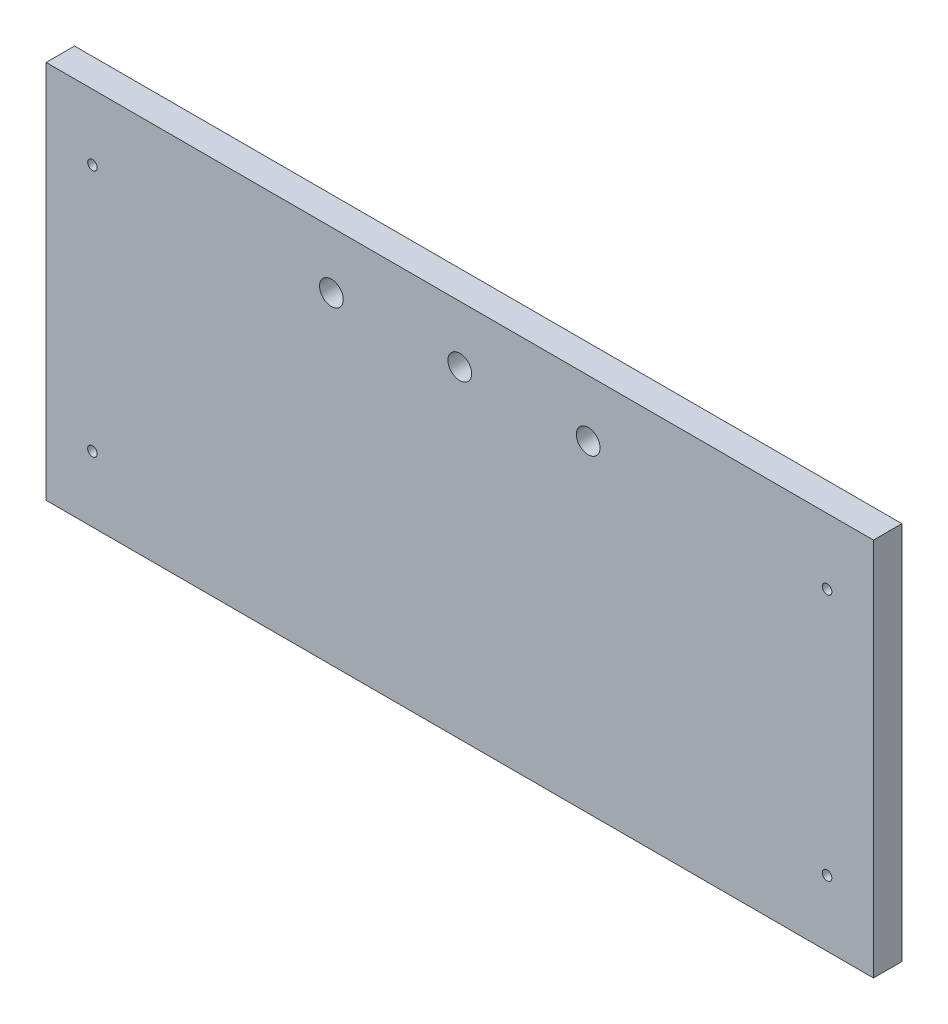
ISO-10303-21;
HEADER;
FILE_DESCRIPTION(('STEP AP214'),'2;1');
FILE_NAME('part.step','',(''),(''),'','','');
FILE_SCHEMA(('AUTOMOTIVE_DESIGN { 1 0 10303 214 1 1 1 1 }'));
ENDSEC;
DATA;
#1=APPLICATION_CONTEXT('core data for automotive mechanical design processes');
#2=APPLICATION_PROTOCOL_DEFINITION('international standard','automotive_design',2000,#1);
#3=PRODUCT_CONTEXT('',#1,'mechanical');
#4=PRODUCT('Part','Part','',(#3));
#5=PRODUCT_RELATED_PRODUCT_CATEGORY('part','',(#4));
#6=PRODUCT_DEFINITION_FORMATION('','',#4);
#7=PRODUCT_DEFINITION_CONTEXT('part definition',#1,'design');
#8=PRODUCT_DEFINITION('design','',#6,#7);
#9=PRODUCT_DEFINITION_SHAPE('','',#8);
#10=(LENGTH_UNIT() NAMED_UNIT(*) SI_UNIT(.MILLI.,.METRE.));
#11=(NAMED_UNIT(*) PLANE_ANGLE_UNIT() SI_UNIT($,.RADIAN.));
#12=(NAMED_UNIT(*) SI_UNIT($,.STERADIAN.) SOLID_ANGLE_UNIT());
#13=UNCERTAINTY_MEASURE_WITH_UNIT(LENGTH_MEASURE(1.E-05),#10,'distance_accuracy_value','');
#14=(GEOMETRIC_REPRESENTATION_CONTEXT(3) GLOBAL_UNCERTAINTY_ASSIGNED_CONTEXT((#13)) GLOBAL_UNIT_ASSIGNED_CONTEXT((#10,
#11,#12)) REPRESENTATION_CONTEXT('',''));
#15=CARTESIAN_POINT('',(0.,0.,0.));
#16=DIRECTION('',(0.,0.,1.));
#17=DIRECTION('',(1.,0.,0.));
#18=AXIS2_PLACEMENT_3D('',#15,#16,#17);
#19=CARTESIAN_POINT('',(0.,0.,9.525));
#20=DIRECTION('',(0.,0.,-1.));
#21=DIRECTION('',(-1.,0.,0.));
#22=AXIS2_PLACEMENT_3D('',#19,#20,#21);
#23=PLANE('',#22);
#24=DIRECTION('',(0.,-1.,0.));
#25=VECTOR('',#24,1.);
#26=CARTESIAN_POINT('',(0.,0.,9.525));
#27=LINE('',#26,#25);
#28=CARTESIAN_POINT('',(0.,127.,9.525));
#29=VERTEX_POINT('',#28);
#30=CARTESIAN_POINT('',(0.,0.,9.525));
#31=VERTEX_POINT('',#30);
#32=EDGE_CURVE('E85',#29,#31,#27,.T.);
#33=ORIENTED_EDGE('',*,*,#32,.T.);
#34=DIRECTION('',(1.,0.,0.));
#35=VECTOR('',#34,1.);
#36=CARTESIAN_POINT('',(0.,0.,9.525));
#37=LINE('',#36,#35);
#38=CARTESIAN_POINT('',(277.05,0.,9.525));
#39=VERTEX_POINT('',#38);
#40=EDGE_CURVE('E80',#31,#39,#37,.T.);
#41=ORIENTED_EDGE('',*,*,#40,.T.);
#42=DIRECTION('',(0.,1.,0.));
#43=VECTOR('',#42,1.);
#44=CARTESIAN_POINT('',(277.05,0.,9.525));
#45=LINE('',#44,#43);
#46=CARTESIAN_POINT('',(277.05,127.,9.525));
#47=VERTEX_POINT('',#46);
#48=EDGE_CURVE('E83',#39,#47,#45,.T.);
#49=ORIENTED_EDGE('',*,*,#48,.T.);
#50=DIRECTION('',(-1.,0.,0.));
#51=VECTOR('',#50,1.);
#52=CARTESIAN_POINT('',(0.,127.,9.525));
#53=LINE('',#52,#51);
#54=EDGE_CURVE('E50',#47,#29,#53,.T.);
#55=ORIENTED_EDGE('',*,*,#54,.T.);
#56=EDGE_LOOP('',(#33,#41,#49,#55));
#57=FACE_BOUND('',#56,.T.);
#58=CARTESIAN_POINT('',(95.525,107.95,9.525));
#59=DIRECTION('',(0.,0.,1.));
#60=DIRECTION('',(1.,0.,0.));
#61=AXIS2_PLACEMENT_3D('',#58,#59,#60);
#62=CIRCLE('',#61,3.96874999999999);
#63=CARTESIAN_POINT('',(91.55625,107.95,9.525));
#64=VERTEX_POINT('',#63);
#65=EDGE_CURVE('E100',#64,#64,#62,.T.);
#66=ORIENTED_EDGE('',*,*,#65,.F.);
#67=EDGE_LOOP('',(#66));
#68=FACE_BOUND('',#67,.T.);
#69=CARTESIAN_POINT('',(138.525,107.95,9.525));
#70=DIRECTION('',(0.,0.,1.));
#71=DIRECTION('',(1.,0.,0.));
#72=AXIS2_PLACEMENT_3D('',#69,#70,#71);
#73=CIRCLE('',#72,3.96874999999999);
#74=CARTESIAN_POINT('',(134.55625,107.95,9.525));
#75=VERTEX_POINT('',#74);
#76=EDGE_CURVE('E115',#75,#75,#73,.T.);
#77=ORIENTED_EDGE('',*,*,#76,.F.);
#78=EDGE_LOOP('',(#77));
#79=FACE_BOUND('',#78,.T.);
#80=CARTESIAN_POINT('',(181.525,107.95,9.525));
#81=DIRECTION('',(0.,0.,1.));
#82=DIRECTION('',(1.,0.,0.));
#83=AXIS2_PLACEMENT_3D('',#80,#81,#82);
#84=CIRCLE('',#83,3.96874999999999);
#85=CARTESIAN_POINT('',(177.55625,107.95,9.525));
#86=VERTEX_POINT('',#85);
#87=EDGE_CURVE('E121',#86,#86,#84,.T.);
#88=ORIENTED_EDGE('',*,*,#87,.F.);
#89=EDGE_LOOP('',(#88));
#90=FACE_BOUND('',#89,.T.);
#91=CARTESIAN_POINT('',(15.525,105.,9.525));
#92=DIRECTION('',(0.,0.,1.));
#93=DIRECTION('',(1.,0.,0.));
#94=AXIS2_PLACEMENT_3D('',#91,#92,#93);
#95=CIRCLE('',#94,1.60000000000001);
#96=CARTESIAN_POINT('',(13.925,105.,9.525));
#97=VERTEX_POINT('',#96);
#98=EDGE_CURVE('E127',#97,#97,#95,.T.);
#99=ORIENTED_EDGE('',*,*,#98,.F.);
#100=EDGE_LOOP('',(#99));
#101=FACE_BOUND('',#100,.T.);
#102=CARTESIAN_POINT('',(15.525,22.,9.525));
#103=DIRECTION('',(0.,0.,1.));
#104=DIRECTION('',(1.,0.,0.));
#105=AXIS2_PLACEMENT_3D('',#102,#103,#104);
#106=CIRCLE('',#105,1.6);
#107=CARTESIAN_POINT('',(13.925,22.,9.525));
#108=VERTEX_POINT('',#107);
#109=EDGE_CURVE('E133',#108,#108,#106,.T.);
#110=ORIENTED_EDGE('',*,*,#109,.F.);
#111=EDGE_LOOP('',(#110));
#112=FACE_BOUND('',#111,.T.);
#113=CARTESIAN_POINT('',(261.525,105.,9.525));
#114=DIRECTION('',(0.,0.,1.));
#115=DIRECTION('',(1.,0.,0.));
#116=AXIS2_PLACEMENT_3D('',#113,#114,#115);
#117=CIRCLE('',#116,1.59999999999997);
#118=CARTESIAN_POINT('',(259.925,105.,9.525));
#119=VERTEX_POINT('',#118);
#120=EDGE_CURVE('E139',#119,#119,#117,.T.);
#121=ORIENTED_EDGE('',*,*,#120,.F.);
#122=EDGE_LOOP('',(#121));
#123=FACE_BOUND('',#122,.T.);
#124=CARTESIAN_POINT('',(261.525,22.,9.525));
#125=DIRECTION('',(0.,0.,1.));
#126=DIRECTION('',(1.,0.,0.));
#127=AXIS2_PLACEMENT_3D('',#124,#125,#126);
#128=CIRCLE('',#127,1.59999999999996);
#129=CARTESIAN_POINT('',(259.925,22.,9.525));
#130=VERTEX_POINT('',#129);
#131=EDGE_CURVE('E145',#130,#130,#128,.T.);
#132=ORIENTED_EDGE('',*,*,#131,.F.);
#133=EDGE_LOOP('',(#132));
#134=FACE_BOUND('',#133,.T.);
#135=ADVANCED_FACE('F33',(#57,#68,#79,#90,#101,#112,#123,#134),#23,.F.);
#136=CARTESIAN_POINT('',(0.,0.,0.));
#137=DIRECTION('',(0.,0.,-1.));
#138=DIRECTION('',(-1.,0.,0.));
#139=AXIS2_PLACEMENT_3D('',#136,#137,#138);
#140=PLANE('',#139);
#141=CARTESIAN_POINT('',(261.525,105.,0.));
#142=DIRECTION('',(0.,0.,1.));
#143=DIRECTION('',(1.,0.,0.));
#144=AXIS2_PLACEMENT_3D('',#141,#142,#143);
#145=CIRCLE('',#144,1.59999999999997);
#146=CARTESIAN_POINT('',(259.925,105.,0.));
#147=VERTEX_POINT('',#146);
#148=EDGE_CURVE('E142',#147,#147,#145,.T.);
#149=ORIENTED_EDGE('',*,*,#148,.T.);
#150=EDGE_LOOP('',(#149));
#151=FACE_BOUND('',#150,.T.);
#152=CARTESIAN_POINT('',(15.525,105.,0.));
#153=DIRECTION('',(0.,0.,1.));
#154=DIRECTION('',(1.,0.,0.));
#155=AXIS2_PLACEMENT_3D('',#152,#153,#154);
#156=CIRCLE('',#155,1.60000000000001);
#157=CARTESIAN_POINT('',(13.925,105.,0.));
#158=VERTEX_POINT('',#157);
#159=EDGE_CURVE('E130',#158,#158,#156,.T.);
#160=ORIENTED_EDGE('',*,*,#159,.T.);
#161=EDGE_LOOP('',(#160));
#162=FACE_BOUND('',#161,.T.);
#163=CARTESIAN_POINT('',(138.525,107.95,0.));
#164=DIRECTION('',(0.,0.,1.));
#165=DIRECTION('',(1.,0.,0.));
#166=AXIS2_PLACEMENT_3D('',#163,#164,#165);
#167=CIRCLE('',#166,3.96874999999999);
#168=CARTESIAN_POINT('',(134.55625,107.95,0.));
#169=VERTEX_POINT('',#168);
#170=EDGE_CURVE('E118',#169,#169,#167,.T.);
#171=ORIENTED_EDGE('',*,*,#170,.T.);
#172=EDGE_LOOP('',(#171));
#173=FACE_BOUND('',#172,.T.);
#174=DIRECTION('',(0.,-1.,0.));
#175=VECTOR('',#174,1.);
#176=CARTESIAN_POINT('',(0.,0.,0.));
#177=LINE('',#176,#175);
#178=CARTESIAN_POINT('',(0.,127.,0.));
#179=VERTEX_POINT('',#178);
#180=CARTESIAN_POINT('',(0.,0.,0.));
#181=VERTEX_POINT('',#180);
#182=EDGE_CURVE('E97',#179,#181,#177,.T.);
#183=ORIENTED_EDGE('',*,*,#182,.F.);
#184=DIRECTION('',(-1.,0.,0.));
#185=VECTOR('',#184,1.);
#186=CARTESIAN_POINT('',(0.,127.,0.));
#187=LINE('',#186,#185);
#188=CARTESIAN_POINT('',(277.05,127.,0.));
#189=VERTEX_POINT('',#188);
#190=EDGE_CURVE('E73',#189,#179,#187,.T.);
#191=ORIENTED_EDGE('',*,*,#190,.F.);
#192=DIRECTION('',(0.,1.,0.));
#193=VECTOR('',#192,1.);
#194=CARTESIAN_POINT('',(277.05,0.,0.));
#195=LINE('',#194,#193);
#196=CARTESIAN_POINT('',(277.05,0.,0.));
#197=VERTEX_POINT('',#196);
#198=EDGE_CURVE('E67',#197,#189,#195,.T.);
#199=ORIENTED_EDGE('',*,*,#198,.F.);
#200=DIRECTION('',(1.,0.,0.));
#201=VECTOR('',#200,1.);
#202=CARTESIAN_POINT('',(0.,0.,0.));
#203=LINE('',#202,#201);
#204=EDGE_CURVE('E89',#181,#197,#203,.T.);
#205=ORIENTED_EDGE('',*,*,#204,.F.);
#206=EDGE_LOOP('',(#183,#191,#199,#205));
#207=FACE_BOUND('',#206,.T.);
#208=CARTESIAN_POINT('',(95.525,107.95,0.));
#209=DIRECTION('',(0.,0.,1.));
#210=DIRECTION('',(1.,0.,0.));
#211=AXIS2_PLACEMENT_3D('',#208,#209,#210);
#212=CIRCLE('',#211,3.96874999999999);
#213=CARTESIAN_POINT('',(91.55625,107.95,0.));
#214=VERTEX_POINT('',#213);
#215=EDGE_CURVE('E112',#214,#214,#212,.T.);
#216=ORIENTED_EDGE('',*,*,#215,.T.);
#217=EDGE_LOOP('',(#216));
#218=FACE_BOUND('',#217,.T.);
#219=CARTESIAN_POINT('',(181.525,107.95,0.));
#220=DIRECTION('',(0.,0.,1.));
#221=DIRECTION('',(1.,0.,0.));
#222=AXIS2_PLACEMENT_3D('',#219,#220,#221);
#223=CIRCLE('',#222,3.96874999999999);
#224=CARTESIAN_POINT('',(177.55625,107.95,0.));
#225=VERTEX_POINT('',#224);
#226=EDGE_CURVE('E124',#225,#225,#223,.T.);
#227=ORIENTED_EDGE('',*,*,#226,.T.);
#228=EDGE_LOOP('',(#227));
#229=FACE_BOUND('',#228,.T.);
#230=CARTESIAN_POINT('',(15.525,22.,0.));
#231=DIRECTION('',(0.,0.,1.));
#232=DIRECTION('',(1.,0.,0.));
#233=AXIS2_PLACEMENT_3D('',#230,#231,#232);
#234=CIRCLE('',#233,1.6);
#235=CARTESIAN_POINT('',(13.925,22.,0.));
#236=VERTEX_POINT('',#235);
#237=EDGE_CURVE('E136',#236,#236,#234,.T.);
#238=ORIENTED_EDGE('',*,*,#237,.T.);
#239=EDGE_LOOP('',(#238));
#240=FACE_BOUND('',#239,.T.);
#241=CARTESIAN_POINT('',(261.525,22.,0.));
#242=DIRECTION('',(0.,0.,1.));
#243=DIRECTION('',(1.,0.,0.));
#244=AXIS2_PLACEMENT_3D('',#241,#242,#243);
#245=CIRCLE('',#244,1.59999999999996);
#246=CARTESIAN_POINT('',(259.925,22.,0.));
#247=VERTEX_POINT('',#246);
#248=EDGE_CURVE('E148',#247,#247,#245,.T.);
#249=ORIENTED_EDGE('',*,*,#248,.T.);
#250=EDGE_LOOP('',(#249));
#251=FACE_BOUND('',#250,.T.);
#252=ADVANCED_FACE('F108',(#151,#162,#173,#207,#218,#229,#240,#251),#140,.T.);
#253=CARTESIAN_POINT('',(0.,0.,9.525));
#254=DIRECTION('',(1.,0.,0.));
#255=DIRECTION('',(0.,0.,-1.));
#256=AXIS2_PLACEMENT_3D('',#253,#254,#255);
#257=PLANE('',#256);
#258=ORIENTED_EDGE('',*,*,#182,.T.);
#259=DIRECTION('',(0.,0.,-1.));
#260=VECTOR('',#259,1.);
#261=CARTESIAN_POINT('',(0.,0.,9.525));
#262=LINE('',#261,#260);
#263=EDGE_CURVE('E11',#31,#181,#262,.T.);
#264=ORIENTED_EDGE('',*,*,#263,.F.);
#265=ORIENTED_EDGE('',*,*,#32,.F.);
#266=DIRECTION('',(0.,0.,-1.));
#267=VECTOR('',#266,1.);
#268=CARTESIAN_POINT('',(0.,127.,9.525));
#269=LINE('',#268,#267);
#270=EDGE_CURVE('E93',#29,#179,#269,.T.);
#271=ORIENTED_EDGE('',*,*,#270,.T.);
#272=EDGE_LOOP('',(#258,#264,#265,#271));
#273=FACE_BOUND('',#272,.T.);
#274=ADVANCED_FACE('F35',(#273),#257,.F.);
#275=CARTESIAN_POINT('',(0.,0.,9.525));
#276=DIRECTION('',(0.,1.,0.));
#277=DIRECTION('',(0.,0.,1.));
#278=AXIS2_PLACEMENT_3D('',#275,#276,#277);
#279=PLANE('',#278);
#280=ORIENTED_EDGE('',*,*,#204,.T.);
#281=DIRECTION('',(0.,0.,-1.));
#282=VECTOR('',#281,1.);
#283=CARTESIAN_POINT('',(277.05,0.,9.525));
#284=LINE('',#283,#282);
#285=EDGE_CURVE('E42',#39,#197,#284,.T.);
#286=ORIENTED_EDGE('',*,*,#285,.F.);
#287=ORIENTED_EDGE('',*,*,#40,.F.);
#288=ORIENTED_EDGE('',*,*,#263,.T.);
#289=EDGE_LOOP('',(#280,#286,#287,#288));
#290=FACE_BOUND('',#289,.T.);
#291=ADVANCED_FACE('F88',(#290),#279,.F.);
#292=CARTESIAN_POINT('',(277.05,0.,9.525));
#293=DIRECTION('',(-1.,0.,0.));
#294=DIRECTION('',(0.,0.,1.));
#295=AXIS2_PLACEMENT_3D('',#292,#293,#294);
#296=PLANE('',#295);
#297=ORIENTED_EDGE('',*,*,#198,.T.);
#298=DIRECTION('',(0.,0.,-1.));
#299=VECTOR('',#298,1.);
#300=CARTESIAN_POINT('',(277.05,127.,9.525));
#301=LINE('',#300,#299);
#302=EDGE_CURVE('E90',#47,#189,#301,.T.);
#303=ORIENTED_EDGE('',*,*,#302,.F.);
#304=ORIENTED_EDGE('',*,*,#48,.F.);
#305=ORIENTED_EDGE('',*,*,#285,.T.);
#306=EDGE_LOOP('',(#297,#303,#304,#305));
#307=FACE_BOUND('',#306,.T.);
#308=ADVANCED_FACE('F91',(#307),#296,.F.);
#309=CARTESIAN_POINT('',(0.,127.,9.525));
#310=DIRECTION('',(0.,-1.,0.));
#311=DIRECTION('',(0.,0.,-1.));
#312=AXIS2_PLACEMENT_3D('',#309,#310,#311);
#313=PLANE('',#312);
#314=ORIENTED_EDGE('',*,*,#190,.T.);
#315=ORIENTED_EDGE('',*,*,#270,.F.);
#316=ORIENTED_EDGE('',*,*,#54,.F.);
#317=ORIENTED_EDGE('',*,*,#302,.T.);
#318=EDGE_LOOP('',(#314,#315,#316,#317));
#319=FACE_BOUND('',#318,.T.);
#320=ADVANCED_FACE('F105',(#319),#313,.F.);
#321=CARTESIAN_POINT('',(95.525,107.95,9.525));
#322=DIRECTION('',(0.,0.,-1.));
#323=DIRECTION('',(-1.,0.,0.));
#324=AXIS2_PLACEMENT_3D('',#321,#322,#323);
#325=CYLINDRICAL_SURFACE('',#324,3.96874999999999);
#326=CARTESIAN_POINT('',(91.55625,107.95,9.525));
#327=CARTESIAN_POINT('',(91.55625,107.95,9.42578125));
#328=CARTESIAN_POINT('',(91.55625,107.95,9.3265625));
#329=CARTESIAN_POINT('',(91.55625,107.95,9.128125));
#330=CARTESIAN_POINT('',(91.55625,107.95,9.02890625));
#331=CARTESIAN_POINT('',(91.55625,107.95,8.83046875));
#332=CARTESIAN_POINT('',(91.55625,107.95,8.73125));
#333=CARTESIAN_POINT('',(91.55625,107.95,8.5328125));
#334=CARTESIAN_POINT('',(91.55625,107.95,8.43359375));
#335=CARTESIAN_POINT('',(91.55625,107.95,8.23515625));
#336=CARTESIAN_POINT('',(91.55625,107.95,8.1359375));
#337=CARTESIAN_POINT('',(91.55625,107.95,7.9375));
#338=CARTESIAN_POINT('',(91.55625,107.95,7.83828125));
#339=CARTESIAN_POINT('',(91.55625,107.95,7.63984375));
#340=CARTESIAN_POINT('',(91.55625,107.95,7.540625));
#341=CARTESIAN_POINT('',(91.55625,107.95,7.3421875));
#342=CARTESIAN_POINT('',(91.55625,107.95,7.24296875));
#343=CARTESIAN_POINT('',(91.55625,107.95,7.04453125));
#344=CARTESIAN_POINT('',(91.55625,107.95,6.9453125));
#345=CARTESIAN_POINT('',(91.55625,107.95,6.746875));
#346=CARTESIAN_POINT('',(91.55625,107.95,6.64765625));
#347=CARTESIAN_POINT('',(91.55625,107.95,6.44921875));
#348=CARTESIAN_POINT('',(91.55625,107.95,6.35));
#349=CARTESIAN_POINT('',(91.55625,107.95,6.1515625));
#350=CARTESIAN_POINT('',(91.55625,107.95,6.05234375));
#351=CARTESIAN_POINT('',(91.55625,107.95,5.85390625));
#352=CARTESIAN_POINT('',(91.55625,107.95,5.7546875));
#353=CARTESIAN_POINT('',(91.55625,107.95,5.55625));
#354=CARTESIAN_POINT('',(91.55625,107.95,5.45703125));
#355=CARTESIAN_POINT('',(91.55625,107.95,5.25859375));
#356=CARTESIAN_POINT('',(91.55625,107.95,5.159375));
#357=CARTESIAN_POINT('',(91.55625,107.95,4.9609375));
#358=CARTESIAN_POINT('',(91.55625,107.95,4.86171875));
#359=CARTESIAN_POINT('',(91.55625,107.95,4.66328125));
#360=CARTESIAN_POINT('',(91.55625,107.95,4.5640625));
#361=CARTESIAN_POINT('',(91.55625,107.95,4.365625));
#362=CARTESIAN_POINT('',(91.55625,107.95,4.26640625));
#363=CARTESIAN_POINT('',(91.55625,107.95,4.06796875));
#364=CARTESIAN_POINT('',(91.55625,107.95,3.96875));
#365=CARTESIAN_POINT('',(91.55625,107.95,3.7703125));
#366=CARTESIAN_POINT('',(91.55625,107.95,3.67109375));
#367=CARTESIAN_POINT('',(91.55625,107.95,3.47265625));
#368=CARTESIAN_POINT('',(91.55625,107.95,3.3734375));
#369=CARTESIAN_POINT('',(91.55625,107.95,3.175));
#370=CARTESIAN_POINT('',(91.55625,107.95,3.07578125));
#371=CARTESIAN_POINT('',(91.55625,107.95,2.87734375));
#372=CARTESIAN_POINT('',(91.55625,107.95,2.778125));
#373=CARTESIAN_POINT('',(91.55625,107.95,2.5796875));
#374=CARTESIAN_POINT('',(91.55625,107.95,2.48046875));
#375=CARTESIAN_POINT('',(91.55625,107.95,2.28203125));
#376=CARTESIAN_POINT('',(91.55625,107.95,2.1828125));
#377=CARTESIAN_POINT('',(91.55625,107.95,1.984375));
#378=CARTESIAN_POINT('',(91.55625,107.95,1.88515625));
#379=CARTESIAN_POINT('',(91.55625,107.95,1.68671875));
#380=CARTESIAN_POINT('',(91.55625,107.95,1.5875));
#381=CARTESIAN_POINT('',(91.55625,107.95,1.3890625));
#382=CARTESIAN_POINT('',(91.55625,107.95,1.28984375));
#383=CARTESIAN_POINT('',(91.55625,107.95,1.09140625));
#384=CARTESIAN_POINT('',(91.55625,107.95,0.992187500000001));
#385=CARTESIAN_POINT('',(91.55625,107.95,0.793750000000001));
#386=CARTESIAN_POINT('',(91.55625,107.95,0.69453125));
#387=CARTESIAN_POINT('',(91.55625,107.95,0.49609375));
#388=CARTESIAN_POINT('',(91.55625,107.95,0.396875));
#389=CARTESIAN_POINT('',(91.55625,107.95,0.1984375));
#390=CARTESIAN_POINT('',(91.55625,107.95,0.0992187500000001));
#391=CARTESIAN_POINT('',(91.55625,107.95,0.));
#392=B_SPLINE_CURVE_WITH_KNOTS('',3,(#326,#327,#328,#329,#330,#331,#332,#333,#334,#335,#336,
#337,#338,#339,#340,#341,#342,#343,#344,#345,#346,#347,#348,#349,#350,#351,#352,#353,#354,#355,
#356,#357,#358,#359,#360,#361,#362,#363,#364,#365,#366,#367,#368,#369,#370,#371,#372,#373,#374,
#375,#376,#377,#378,#379,#380,#381,#382,#383,#384,#385,#386,#387,#388,#389,#390,#391),
.UNSPECIFIED.,.F.,.F.,(4,2,2,2,2,2,2,2,2,2,2,2,2,2,2,2,2,2,2,2,2,2,2,2,2,2,2,2,2,2,2,2,4),(0.,
0.297656249999998,0.595312499999999,0.892968749999999,1.190625,1.48828125,1.7859375,2.08359375,
2.38125,2.67890625,2.9765625,3.27421875,3.571875,3.86953125,4.1671875,4.46484375,4.7625,
5.06015625,5.3578125,5.65546875,5.953125,6.25078125,6.5484375,6.84609375,7.14375,7.44140625,
7.7390625,8.03671875,8.334375,8.63203125,8.9296875,9.22734375,9.525),.UNSPECIFIED.);
#393=EDGE_CURVE('BSEAM165',#64,#214,#392,.T.);
#394=ORIENTED_EDGE('',*,*,#65,.T.);
#395=ORIENTED_EDGE('',*,*,#215,.F.);
#396=ORIENTED_EDGE('',*,*,#393,.T.);
#397=ORIENTED_EDGE('',*,*,#393,.F.);
#398=EDGE_LOOP('',(#394,#396,#395,#397));
#399=FACE_BOUND('',#398,.T.);
#400=ADVANCED_FACE('F165',(#399),#325,.F.);
#401=CARTESIAN_POINT('',(138.525,107.95,9.525));
#402=DIRECTION('',(0.,0.,-1.));
#403=DIRECTION('',(-1.,0.,0.));
#404=AXIS2_PLACEMENT_3D('',#401,#402,#403);
#405=CYLINDRICAL_SURFACE('',#404,3.96874999999999);
#406=CARTESIAN_POINT('',(134.55625,107.95,9.525));
#407=CARTESIAN_POINT('',(134.55625,107.95,9.42578125));
#408=CARTESIAN_POINT('',(134.55625,107.95,9.3265625));
#409=CARTESIAN_POINT('',(134.55625,107.95,9.128125));
#410=CARTESIAN_POINT('',(134.55625,107.95,9.02890625));
#411=CARTESIAN_POINT('',(134.55625,107.95,8.83046875));
#412=CARTESIAN_POINT('',(134.55625,107.95,8.73125));
#413=CARTESIAN_POINT('',(134.55625,107.95,8.5328125));
#414=CARTESIAN_POINT('',(134.55625,107.95,8.43359375));
#415=CARTESIAN_POINT('',(134.55625,107.95,8.23515625));
#416=CARTESIAN_POINT('',(134.55625,107.95,8.1359375));
#417=CARTESIAN_POINT('',(134.55625,107.95,7.9375));
#418=CARTESIAN_POINT('',(134.55625,107.95,7.83828125));
#419=CARTESIAN_POINT('',(134.55625,107.95,7.63984375));
#420=CARTESIAN_POINT('',(134.55625,107.95,7.540625));
#421=CARTESIAN_POINT('',(134.55625,107.95,7.3421875));
#422=CARTESIAN_POINT('',(134.55625,107.95,7.24296875));
#423=CARTESIAN_POINT('',(134.55625,107.95,7.04453125));
#424=CARTESIAN_POINT('',(134.55625,107.95,6.9453125));
#425=CARTESIAN_POINT('',(134.55625,107.95,6.746875));
#426=CARTESIAN_POINT('',(134.55625,107.95,6.64765625));
#427=CARTESIAN_POINT('',(134.55625,107.95,6.44921875));
#428=CARTESIAN_POINT('',(134.55625,107.95,6.35));
#429=CARTESIAN_POINT('',(134.55625,107.95,6.1515625));
#430=CARTESIAN_POINT('',(134.55625,107.95,6.05234375));
#431=CARTESIAN_POINT('',(134.55625,107.95,5.85390625));
#432=CARTESIAN_POINT('',(134.55625,107.95,5.7546875));
#433=CARTESIAN_POINT('',(134.55625,107.95,5.55625));
#434=CARTESIAN_POINT('',(134.55625,107.95,5.45703125));
#435=CARTESIAN_POINT('',(134.55625,107.95,5.25859375));
#436=CARTESIAN_POINT('',(134.55625,107.95,5.159375));
#437=CARTESIAN_POINT('',(134.55625,107.95,4.9609375));
#438=CARTESIAN_POINT('',(134.55625,107.95,4.86171875));
#439=CARTESIAN_POINT('',(134.55625,107.95,4.66328125));
#440=CARTESIAN_POINT('',(134.55625,107.95,4.5640625));
#441=CARTESIAN_POINT('',(134.55625,107.95,4.365625));
#442=CARTESIAN_POINT('',(134.55625,107.95,4.26640625));
#443=CARTESIAN_POINT('',(134.55625,107.95,4.06796875));
#444=CARTESIAN_POINT('',(134.55625,107.95,3.96875));
#445=CARTESIAN_POINT('',(134.55625,107.95,3.7703125));
#446=CARTESIAN_POINT('',(134.55625,107.95,3.67109375));
#447=CARTESIAN_POINT('',(134.55625,107.95,3.47265625));
#448=CARTESIAN_POINT('',(134.55625,107.95,3.3734375));
#449=CARTESIAN_POINT('',(134.55625,107.95,3.175));
#450=CARTESIAN_POINT('',(134.55625,107.95,3.07578125));
#451=CARTESIAN_POINT('',(134.55625,107.95,2.87734375));
#452=CARTESIAN_POINT('',(134.55625,107.95,2.778125));
#453=CARTESIAN_POINT('',(134.55625,107.95,2.5796875));
#454=CARTESIAN_POINT('',(134.55625,107.95,2.48046875));
#455=CARTESIAN_POINT('',(134.55625,107.95,2.28203125));
#456=CARTESIAN_POINT('',(134.55625,107.95,2.1828125));
#457=CARTESIAN_POINT('',(134.55625,107.95,1.984375));
#458=CARTESIAN_POINT('',(134.55625,107.95,1.88515625));
#459=CARTESIAN_POINT('',(134.55625,107.95,1.68671875));
#460=CARTESIAN_POINT('',(134.55625,107.95,1.5875));
#461=CARTESIAN_POINT('',(134.55625,107.95,1.3890625));
#462=CARTESIAN_POINT('',(134.55625,107.95,1.28984375));
#463=CARTESIAN_POINT('',(134.55625,107.95,1.09140625));
#464=CARTESIAN_POINT('',(134.55625,107.95,0.992187500000001));
#465=CARTESIAN_POINT('',(134.55625,107.95,0.793750000000001));
#466=CARTESIAN_POINT('',(134.55625,107.95,0.69453125));
#467=CARTESIAN_POINT('',(134.55625,107.95,0.49609375));
#468=CARTESIAN_POINT('',(134.55625,107.95,0.396875));
#469=CARTESIAN_POINT('',(134.55625,107.95,0.1984375));
#470=CARTESIAN_POINT('',(134.55625,107.95,0.0992187500000001));
#471=CARTESIAN_POINT('',(134.55625,107.95,0.));
#472=B_SPLINE_CURVE_WITH_KNOTS('',3,(#406,#407,#408,#409,#410,#411,#412,#413,#414,#415,#416,
#417,#418,#419,#420,#421,#422,#423,#424,#425,#426,#427,#428,#429,#430,#431,#432,#433,#434,#435,
#436,#437,#438,#439,#440,#441,#442,#443,#444,#445,#446,#447,#448,#449,#450,#451,#452,#453,#454,
#455,#456,#457,#458,#459,#460,#461,#462,#463,#464,#465,#466,#467,#468,#469,#470,#471),
.UNSPECIFIED.,.F.,.F.,(4,2,2,2,2,2,2,2,2,2,2,2,2,2,2,2,2,2,2,2,2,2,2,2,2,2,2,2,2,2,2,2,4),(0.,
0.297656249999998,0.595312499999999,0.892968749999999,1.190625,1.48828125,1.7859375,2.08359375,
2.38125,2.67890625,2.9765625,3.27421875,3.571875,3.86953125,4.1671875,4.46484375,4.7625,
5.06015625,5.3578125,5.65546875,5.953125,6.25078125,6.5484375,6.84609375,7.14375,7.44140625,
7.7390625,8.03671875,8.334375,8.63203125,8.9296875,9.22734375,9.525),.UNSPECIFIED.);
#473=EDGE_CURVE('BSEAM211',#75,#169,#472,.T.);
#474=ORIENTED_EDGE('',*,*,#76,.T.);
#475=ORIENTED_EDGE('',*,*,#170,.F.);
#476=ORIENTED_EDGE('',*,*,#473,.T.);
#477=ORIENTED_EDGE('',*,*,#473,.F.);
#478=EDGE_LOOP('',(#474,#476,#475,#477));
#479=FACE_BOUND('',#478,.T.);
#480=ADVANCED_FACE('F211',(#479),#405,.F.);
#481=CARTESIAN_POINT('',(181.525,107.95,9.525));
#482=DIRECTION('',(0.,0.,-1.));
#483=DIRECTION('',(-1.,0.,0.));
#484=AXIS2_PLACEMENT_3D('',#481,#482,#483);
#485=CYLINDRICAL_SURFACE('',#484,3.96874999999999);
#486=CARTESIAN_POINT('',(177.55625,107.95,9.525));
#487=CARTESIAN_POINT('',(177.55625,107.95,9.42578125));
#488=CARTESIAN_POINT('',(177.55625,107.95,9.3265625));
#489=CARTESIAN_POINT('',(177.55625,107.95,9.128125));
#490=CARTESIAN_POINT('',(177.55625,107.95,9.02890625));
#491=CARTESIAN_POINT('',(177.55625,107.95,8.83046875));
#492=CARTESIAN_POINT('',(177.55625,107.95,8.73125));
#493=CARTESIAN_POINT('',(177.55625,107.95,8.5328125));
#494=CARTESIAN_POINT('',(177.55625,107.95,8.43359375));
#495=CARTESIAN_POINT('',(177.55625,107.95,8.23515625));
#496=CARTESIAN_POINT('',(177.55625,107.95,8.1359375));
#497=CARTESIAN_POINT('',(177.55625,107.95,7.9375));
#498=CARTESIAN_POINT('',(177.55625,107.95,7.83828125));
#499=CARTESIAN_POINT('',(177.55625,107.95,7.63984375));
#500=CARTESIAN_POINT('',(177.55625,107.95,7.540625));
#501=CARTESIAN_POINT('',(177.55625,107.95,7.3421875));
#502=CARTESIAN_POINT('',(177.55625,107.95,7.24296875));
#503=CARTESIAN_POINT('',(177.55625,107.95,7.04453125));
#504=CARTESIAN_POINT('',(177.55625,107.95,6.9453125));
#505=CARTESIAN_POINT('',(177.55625,107.95,6.746875));
#506=CARTESIAN_POINT('',(177.55625,107.95,6.64765625));
#507=CARTESIAN_POINT('',(177.55625,107.95,6.44921875));
#508=CARTESIAN_POINT('',(177.55625,107.95,6.35));
#509=CARTESIAN_POINT('',(177.55625,107.95,6.1515625));
#510=CARTESIAN_POINT('',(177.55625,107.95,6.05234375));
#511=CARTESIAN_POINT('',(177.55625,107.95,5.85390625));
#512=CARTESIAN_POINT('',(177.55625,107.95,5.7546875));
#513=CARTESIAN_POINT('',(177.55625,107.95,5.55625));
#514=CARTESIAN_POINT('',(177.55625,107.95,5.45703125));
#515=CARTESIAN_POINT('',(177.55625,107.95,5.25859375));
#516=CARTESIAN_POINT('',(177.55625,107.95,5.159375));
#517=CARTESIAN_POINT('',(177.55625,107.95,4.9609375));
#518=CARTESIAN_POINT('',(177.55625,107.95,4.86171875));
#519=CARTESIAN_POINT('',(177.55625,107.95,4.66328125));
#520=CARTESIAN_POINT('',(177.55625,107.95,4.5640625));
#521=CARTESIAN_POINT('',(177.55625,107.95,4.365625));
#522=CARTESIAN_POINT('',(177.55625,107.95,4.26640625));
#523=CARTESIAN_POINT('',(177.55625,107.95,4.06796875));
#524=CARTESIAN_POINT('',(177.55625,107.95,3.96875));
#525=CARTESIAN_POINT('',(177.55625,107.95,3.7703125));
#526=CARTESIAN_POINT('',(177.55625,107.95,3.67109375));
#527=CARTESIAN_POINT('',(177.55625,107.95,3.47265625));
#528=CARTESIAN_POINT('',(177.55625,107.95,3.3734375));
#529=CARTESIAN_POINT('',(177.55625,107.95,3.175));
#530=CARTESIAN_POINT('',(177.55625,107.95,3.07578125));
#531=CARTESIAN_POINT('',(177.55625,107.95,2.87734375));
#532=CARTESIAN_POINT('',(177.55625,107.95,2.778125));
#533=CARTESIAN_POINT('',(177.55625,107.95,2.5796875));
#534=CARTESIAN_POINT('',(177.55625,107.95,2.48046875));
#535=CARTESIAN_POINT('',(177.55625,107.95,2.28203125));
#536=CARTESIAN_POINT('',(177.55625,107.95,2.1828125));
#537=CARTESIAN_POINT('',(177.55625,107.95,1.984375));
#538=CARTESIAN_POINT('',(177.55625,107.95,1.88515625));
#539=CARTESIAN_POINT('',(177.55625,107.95,1.68671875));
#540=CARTESIAN_POINT('',(177.55625,107.95,1.5875));
#541=CARTESIAN_POINT('',(177.55625,107.95,1.3890625));
#542=CARTESIAN_POINT('',(177.55625,107.95,1.28984375));
#543=CARTESIAN_POINT('',(177.55625,107.95,1.09140625));
#544=CARTESIAN_POINT('',(177.55625,107.95,0.992187500000001));
#545=CARTESIAN_POINT('',(177.55625,107.95,0.793750000000001));
#546=CARTESIAN_POINT('',(177.55625,107.95,0.69453125));
#547=CARTESIAN_POINT('',(177.55625,107.95,0.49609375));
#548=CARTESIAN_POINT('',(177.55625,107.95,0.396875));
#549=CARTESIAN_POINT('',(177.55625,107.95,0.1984375));
#550=CARTESIAN_POINT('',(177.55625,107.95,0.0992187500000001));
#551=CARTESIAN_POINT('',(177.55625,107.95,0.));
#552=B_SPLINE_CURVE_WITH_KNOTS('',3,(#486,#487,#488,#489,#490,#491,#492,#493,#494,#495,#496,
#497,#498,#499,#500,#501,#502,#503,#504,#505,#506,#507,#508,#509,#510,#511,#512,#513,#514,#515,
#516,#517,#518,#519,#520,#521,#522,#523,#524,#525,#526,#527,#528,#529,#530,#531,#532,#533,#534,
#535,#536,#537,#538,#539,#540,#541,#542,#543,#544,#545,#546,#547,#548,#549,#550,#551),
.UNSPECIFIED.,.F.,.F.,(4,2,2,2,2,2,2,2,2,2,2,2,2,2,2,2,2,2,2,2,2,2,2,2,2,2,2,2,2,2,2,2,4),(0.,
0.297656249999998,0.595312499999999,0.892968749999999,1.190625,1.48828125,1.7859375,2.08359375,
2.38125,2.67890625,2.9765625,3.27421875,3.571875,3.86953125,4.1671875,4.46484375,4.7625,
5.06015625,5.3578125,5.65546875,5.953125,6.25078125,6.5484375,6.84609375,7.14375,7.44140625,
7.7390625,8.03671875,8.334375,8.63203125,8.9296875,9.22734375,9.525),.UNSPECIFIED.);
#553=EDGE_CURVE('BSEAM219',#86,#225,#552,.T.);
#554=ORIENTED_EDGE('',*,*,#87,.T.);
#555=ORIENTED_EDGE('',*,*,#226,.F.);
#556=ORIENTED_EDGE('',*,*,#553,.T.);
#557=ORIENTED_EDGE('',*,*,#553,.F.);
#558=EDGE_LOOP('',(#554,#556,#555,#557));
#559=FACE_BOUND('',#558,.T.);
#560=ADVANCED_FACE('F219',(#559),#485,.F.);
#561=CARTESIAN_POINT('',(15.525,105.,9.525));
#562=DIRECTION('',(0.,0.,-1.));
#563=DIRECTION('',(-1.,0.,0.));
#564=AXIS2_PLACEMENT_3D('',#561,#562,#563);
#565=CYLINDRICAL_SURFACE('',#564,1.60000000000001);
#566=CARTESIAN_POINT('',(13.925,105.,9.525));
#567=CARTESIAN_POINT('',(13.925,105.,9.42578125));
#568=CARTESIAN_POINT('',(13.925,105.,9.3265625));
#569=CARTESIAN_POINT('',(13.925,105.,9.128125));
#570=CARTESIAN_POINT('',(13.925,105.,9.02890625));
#571=CARTESIAN_POINT('',(13.925,105.,8.83046875));
#572=CARTESIAN_POINT('',(13.925,105.,8.73125));
#573=CARTESIAN_POINT('',(13.925,105.,8.5328125));
#574=CARTESIAN_POINT('',(13.925,105.,8.43359375));
#575=CARTESIAN_POINT('',(13.925,105.,8.23515625));
#576=CARTESIAN_POINT('',(13.925,105.,8.1359375));
#577=CARTESIAN_POINT('',(13.925,105.,7.9375));
#578=CARTESIAN_POINT('',(13.925,105.,7.83828125));
#579=CARTESIAN_POINT('',(13.925,105.,7.63984375));
#580=CARTESIAN_POINT('',(13.925,105.,7.540625));
#581=CARTESIAN_POINT('',(13.925,105.,7.3421875));
#582=CARTESIAN_POINT('',(13.925,105.,7.24296875));
#583=CARTESIAN_POINT('',(13.925,105.,7.04453125));
#584=CARTESIAN_POINT('',(13.925,105.,6.9453125));
#585=CARTESIAN_POINT('',(13.925,105.,6.746875));
#586=CARTESIAN_POINT('',(13.925,105.,6.64765625));
#587=CARTESIAN_POINT('',(13.925,105.,6.44921875));
#588=CARTESIAN_POINT('',(13.925,105.,6.35));
#589=CARTESIAN_POINT('',(13.925,105.,6.1515625));
#590=CARTESIAN_POINT('',(13.925,105.,6.05234375));
#591=CARTESIAN_POINT('',(13.925,105.,5.85390625));
#592=CARTESIAN_POINT('',(13.925,105.,5.7546875));
#593=CARTESIAN_POINT('',(13.925,105.,5.55625));
#594=CARTESIAN_POINT('',(13.925,105.,5.45703125));
#595=CARTESIAN_POINT('',(13.925,105.,5.25859375));
#596=CARTESIAN_POINT('',(13.925,105.,5.159375));
#597=CARTESIAN_POINT('',(13.925,105.,4.9609375));
#598=CARTESIAN_POINT('',(13.925,105.,4.86171875));
#599=CARTESIAN_POINT('',(13.925,105.,4.66328125));
#600=CARTESIAN_POINT('',(13.925,105.,4.5640625));
#601=CARTESIAN_POINT('',(13.925,105.,4.365625));
#602=CARTESIAN_POINT('',(13.925,105.,4.26640625));
#603=CARTESIAN_POINT('',(13.925,105.,4.06796875));
#604=CARTESIAN_POINT('',(13.925,105.,3.96875));
#605=CARTESIAN_POINT('',(13.925,105.,3.7703125));
#606=CARTESIAN_POINT('',(13.925,105.,3.67109375));
#607=CARTESIAN_POINT('',(13.925,105.,3.47265625));
#608=CARTESIAN_POINT('',(13.925,105.,3.3734375));
#609=CARTESIAN_POINT('',(13.925,105.,3.175));
#610=CARTESIAN_POINT('',(13.925,105.,3.07578125));
#611=CARTESIAN_POINT('',(13.925,105.,2.87734375));
#612=CARTESIAN_POINT('',(13.925,105.,2.778125));
#613=CARTESIAN_POINT('',(13.925,105.,2.5796875));
#614=CARTESIAN_POINT('',(13.925,105.,2.48046875));
#615=CARTESIAN_POINT('',(13.925,105.,2.28203125));
#616=CARTESIAN_POINT('',(13.925,105.,2.1828125));
#617=CARTESIAN_POINT('',(13.925,105.,1.984375));
#618=CARTESIAN_POINT('',(13.925,105.,1.88515625));
#619=CARTESIAN_POINT('',(13.925,105.,1.68671875));
#620=CARTESIAN_POINT('',(13.925,105.,1.5875));
#621=CARTESIAN_POINT('',(13.925,105.,1.3890625));
#622=CARTESIAN_POINT('',(13.925,105.,1.28984375));
#623=CARTESIAN_POINT('',(13.925,105.,1.09140625));
#624=CARTESIAN_POINT('',(13.925,105.,0.992187500000001));
#625=CARTESIAN_POINT('',(13.925,105.,0.793750000000001));
#626=CARTESIAN_POINT('',(13.925,105.,0.69453125));
#627=CARTESIAN_POINT('',(13.925,105.,0.49609375));
#628=CARTESIAN_POINT('',(13.925,105.,0.396875));
#629=CARTESIAN_POINT('',(13.925,105.,0.1984375));
#630=CARTESIAN_POINT('',(13.925,105.,0.0992187500000001));
#631=CARTESIAN_POINT('',(13.925,105.,0.));
#632=B_SPLINE_CURVE_WITH_KNOTS('',3,(#566,#567,#568,#569,#570,#571,#572,#573,#574,#575,#576,
#577,#578,#579,#580,#581,#582,#583,#584,#585,#586,#587,#588,#589,#590,#591,#592,#593,#594,#595,
#596,#597,#598,#599,#600,#601,#602,#603,#604,#605,#606,#607,#608,#609,#610,#611,#612,#613,#614,
#615,#616,#617,#618,#619,#620,#621,#622,#623,#624,#625,#626,#627,#628,#629,#630,#631),
.UNSPECIFIED.,.F.,.F.,(4,2,2,2,2,2,2,2,2,2,2,2,2,2,2,2,2,2,2,2,2,2,2,2,2,2,2,2,2,2,2,2,4),(0.,
0.29765625,0.5953125,0.892968750000001,1.190625,1.48828125,1.7859375,2.08359375,2.38125,
2.67890625,2.9765625,3.27421875,3.571875,3.86953125,4.1671875,4.46484375,4.7625,5.06015625,
5.3578125,5.65546875,5.953125,6.25078125,6.5484375,6.84609375,7.14375,7.44140625,7.7390625,
8.03671875,8.334375,8.63203125,8.9296875,9.22734375,9.525),.UNSPECIFIED.);
#633=EDGE_CURVE('BSEAM227',#97,#158,#632,.T.);
#634=ORIENTED_EDGE('',*,*,#98,.T.);
#635=ORIENTED_EDGE('',*,*,#159,.F.);
#636=ORIENTED_EDGE('',*,*,#633,.T.);
#637=ORIENTED_EDGE('',*,*,#633,.F.);
#638=EDGE_LOOP('',(#634,#636,#635,#637));
#639=FACE_BOUND('',#638,.T.);
#640=ADVANCED_FACE('F227',(#639),#565,.F.);
#641=CARTESIAN_POINT('',(15.525,22.,9.525));
#642=DIRECTION('',(0.,0.,-1.));
#643=DIRECTION('',(-1.,0.,0.));
#644=AXIS2_PLACEMENT_3D('',#641,#642,#643);
#645=CYLINDRICAL_SURFACE('',#644,1.6);
#646=CARTESIAN_POINT('',(13.925,22.,9.525));
#647=CARTESIAN_POINT('',(13.925,22.,9.42578125));
#648=CARTESIAN_POINT('',(13.925,22.,9.3265625));
#649=CARTESIAN_POINT('',(13.925,22.,9.128125));
#650=CARTESIAN_POINT('',(13.925,22.,9.02890625));
#651=CARTESIAN_POINT('',(13.925,22.,8.83046875));
#652=CARTESIAN_POINT('',(13.925,22.,8.73125));
#653=CARTESIAN_POINT('',(13.925,22.,8.5328125));
#654=CARTESIAN_POINT('',(13.925,22.,8.43359375));
#655=CARTESIAN_POINT('',(13.925,22.,8.23515625));
#656=CARTESIAN_POINT('',(13.925,22.,8.1359375));
#657=CARTESIAN_POINT('',(13.925,22.,7.9375));
#658=CARTESIAN_POINT('',(13.925,22.,7.83828125));
#659=CARTESIAN_POINT('',(13.925,22.,7.63984375));
#660=CARTESIAN_POINT('',(13.925,22.,7.540625));
#661=CARTESIAN_POINT('',(13.925,22.,7.3421875));
#662=CARTESIAN_POINT('',(13.925,22.,7.24296875));
#663=CARTESIAN_POINT('',(13.925,22.,7.04453125));
#664=CARTESIAN_POINT('',(13.925,22.,6.9453125));
#665=CARTESIAN_POINT('',(13.925,22.,6.746875));
#666=CARTESIAN_POINT('',(13.925,22.,6.64765625));
#667=CARTESIAN_POINT('',(13.925,22.,6.44921875));
#668=CARTESIAN_POINT('',(13.925,22.,6.35));
#669=CARTESIAN_POINT('',(13.925,22.,6.1515625));
#670=CARTESIAN_POINT('',(13.925,22.,6.05234375));
#671=CARTESIAN_POINT('',(13.925,22.,5.85390625));
#672=CARTESIAN_POINT('',(13.925,22.,5.7546875));
#673=CARTESIAN_POINT('',(13.925,22.,5.55625));
#674=CARTESIAN_POINT('',(13.925,22.,5.45703125));
#675=CARTESIAN_POINT('',(13.925,22.,5.25859375));
#676=CARTESIAN_POINT('',(13.925,22.,5.159375));
#677=CARTESIAN_POINT('',(13.925,22.,4.9609375));
#678=CARTESIAN_POINT('',(13.925,22.,4.86171875));
#679=CARTESIAN_POINT('',(13.925,22.,4.66328125));
#680=CARTESIAN_POINT('',(13.925,22.,4.5640625));
#681=CARTESIAN_POINT('',(13.925,22.,4.365625));
#682=CARTESIAN_POINT('',(13.925,22.,4.26640625));
#683=CARTESIAN_POINT('',(13.925,22.,4.06796875));
#684=CARTESIAN_POINT('',(13.925,22.,3.96875));
#685=CARTESIAN_POINT('',(13.925,22.,3.7703125));
#686=CARTESIAN_POINT('',(13.925,22.,3.67109375));
#687=CARTESIAN_POINT('',(13.925,22.,3.47265625));
#688=CARTESIAN_POINT('',(13.925,22.,3.3734375));
#689=CARTESIAN_POINT('',(13.925,22.,3.175));
#690=CARTESIAN_POINT('',(13.925,22.,3.07578125));
#691=CARTESIAN_POINT('',(13.925,22.,2.87734375));
#692=CARTESIAN_POINT('',(13.925,22.,2.778125));
#693=CARTESIAN_POINT('',(13.925,22.,2.5796875));
#694=CARTESIAN_POINT('',(13.925,22.,2.48046875));
#695=CARTESIAN_POINT('',(13.925,22.,2.28203125));
#696=CARTESIAN_POINT('',(13.925,22.,2.1828125));
#697=CARTESIAN_POINT('',(13.925,22.,1.984375));
#698=CARTESIAN_POINT('',(13.925,22.,1.88515625));
#699=CARTESIAN_POINT('',(13.925,22.,1.68671875));
#700=CARTESIAN_POINT('',(13.925,22.,1.5875));
#701=CARTESIAN_POINT('',(13.925,22.,1.3890625));
#702=CARTESIAN_POINT('',(13.925,22.,1.28984375));
#703=CARTESIAN_POINT('',(13.925,22.,1.09140625));
#704=CARTESIAN_POINT('',(13.925,22.,0.992187500000001));
#705=CARTESIAN_POINT('',(13.925,22.,0.793750000000001));
#706=CARTESIAN_POINT('',(13.925,22.,0.69453125));
#707=CARTESIAN_POINT('',(13.925,22.,0.49609375));
#708=CARTESIAN_POINT('',(13.925,22.,0.396875));
#709=CARTESIAN_POINT('',(13.925,22.,0.1984375));
#710=CARTESIAN_POINT('',(13.925,22.,0.0992187500000001));
#711=CARTESIAN_POINT('',(13.925,22.,0.));
#712=B_SPLINE_CURVE_WITH_KNOTS('',3,(#646,#647,#648,#649,#650,#651,#652,#653,#654,#655,#656,
#657,#658,#659,#660,#661,#662,#663,#664,#665,#666,#667,#668,#669,#670,#671,#672,#673,#674,#675,
#676,#677,#678,#679,#680,#681,#682,#683,#684,#685,#686,#687,#688,#689,#690,#691,#692,#693,#694,
#695,#696,#697,#698,#699,#700,#701,#702,#703,#704,#705,#706,#707,#708,#709,#710,#711),
.UNSPECIFIED.,.F.,.F.,(4,2,2,2,2,2,2,2,2,2,2,2,2,2,2,2,2,2,2,2,2,2,2,2,2,2,2,2,2,2,2,2,4),(0.,
0.29765625,0.5953125,0.892968750000001,1.190625,1.48828125,1.7859375,2.08359375,2.38125,
2.67890625,2.9765625,3.27421875,3.571875,3.86953125,4.1671875,4.46484375,4.7625,5.06015625,
5.3578125,5.65546875,5.953125,6.25078125,6.5484375,6.84609375,7.14375,7.44140625,7.7390625,
8.03671875,8.334375,8.63203125,8.9296875,9.22734375,9.525),.UNSPECIFIED.);
#713=EDGE_CURVE('BSEAM236',#108,#236,#712,.T.);
#714=ORIENTED_EDGE('',*,*,#109,.T.);
#715=ORIENTED_EDGE('',*,*,#237,.F.);
#716=ORIENTED_EDGE('',*,*,#713,.T.);
#717=ORIENTED_EDGE('',*,*,#713,.F.);
#718=EDGE_LOOP('',(#714,#716,#715,#717));
#719=FACE_BOUND('',#718,.T.);
#720=ADVANCED_FACE('F236',(#719),#645,.F.);
#721=CARTESIAN_POINT('',(261.525,105.,9.525));
#722=DIRECTION('',(0.,0.,-1.));
#723=DIRECTION('',(-1.,0.,0.));
#724=AXIS2_PLACEMENT_3D('',#721,#722,#723);
#725=CYLINDRICAL_SURFACE('',#724,1.59999999999997);
#726=CARTESIAN_POINT('',(259.925,105.,9.525));
#727=CARTESIAN_POINT('',(259.925,105.,9.42578125));
#728=CARTESIAN_POINT('',(259.925,105.,9.3265625));
#729=CARTESIAN_POINT('',(259.925,105.,9.128125));
#730=CARTESIAN_POINT('',(259.925,105.,9.02890625));
#731=CARTESIAN_POINT('',(259.925,105.,8.83046875));
#732=CARTESIAN_POINT('',(259.925,105.,8.73125));
#733=CARTESIAN_POINT('',(259.925,105.,8.5328125));
#734=CARTESIAN_POINT('',(259.925,105.,8.43359375));
#735=CARTESIAN_POINT('',(259.925,105.,8.23515625));
#736=CARTESIAN_POINT('',(259.925,105.,8.1359375));
#737=CARTESIAN_POINT('',(259.925,105.,7.9375));
#738=CARTESIAN_POINT('',(259.925,105.,7.83828125));
#739=CARTESIAN_POINT('',(259.925,105.,7.63984375));
#740=CARTESIAN_POINT('',(259.925,105.,7.540625));
#741=CARTESIAN_POINT('',(259.925,105.,7.3421875));
#742=CARTESIAN_POINT('',(259.925,105.,7.24296875));
#743=CARTESIAN_POINT('',(259.925,105.,7.04453125));
#744=CARTESIAN_POINT('',(259.925,105.,6.9453125));
#745=CARTESIAN_POINT('',(259.925,105.,6.746875));
#746=CARTESIAN_POINT('',(259.925,105.,6.64765625));
#747=CARTESIAN_POINT('',(259.925,105.,6.44921875));
#748=CARTESIAN_POINT('',(259.925,105.,6.35));
#749=CARTESIAN_POINT('',(259.925,105.,6.1515625));
#750=CARTESIAN_POINT('',(259.925,105.,6.05234375));
#751=CARTESIAN_POINT('',(259.925,105.,5.85390625));
#752=CARTESIAN_POINT('',(259.925,105.,5.7546875));
#753=CARTESIAN_POINT('',(259.925,105.,5.55625));
#754=CARTESIAN_POINT('',(259.925,105.,5.45703125));
#755=CARTESIAN_POINT('',(259.925,105.,5.25859375));
#756=CARTESIAN_POINT('',(259.925,105.,5.159375));
#757=CARTESIAN_POINT('',(259.925,105.,4.9609375));
#758=CARTESIAN_POINT('',(259.925,105.,4.86171875));
#759=CARTESIAN_POINT('',(259.925,105.,4.66328125));
#760=CARTESIAN_POINT('',(259.925,105.,4.5640625));
#761=CARTESIAN_POINT('',(259.925,105.,4.365625));
#762=CARTESIAN_POINT('',(259.925,105.,4.26640625));
#763=CARTESIAN_POINT('',(259.925,105.,4.06796875));
#764=CARTESIAN_POINT('',(259.925,105.,3.96875));
#765=CARTESIAN_POINT('',(259.925,105.,3.7703125));
#766=CARTESIAN_POINT('',(259.925,105.,3.67109375));
#767=CARTESIAN_POINT('',(259.925,105.,3.47265625));
#768=CARTESIAN_POINT('',(259.925,105.,3.3734375));
#769=CARTESIAN_POINT('',(259.925,105.,3.175));
#770=CARTESIAN_POINT('',(259.925,105.,3.07578125));
#771=CARTESIAN_POINT('',(259.925,105.,2.87734375));
#772=CARTESIAN_POINT('',(259.925,105.,2.778125));
#773=CARTESIAN_POINT('',(259.925,105.,2.5796875));
#774=CARTESIAN_POINT('',(259.925,105.,2.48046875));
#775=CARTESIAN_POINT('',(259.925,105.,2.28203125));
#776=CARTESIAN_POINT('',(259.925,105.,2.1828125));
#777=CARTESIAN_POINT('',(259.925,105.,1.984375));
#778=CARTESIAN_POINT('',(259.925,105.,1.88515625));
#779=CARTESIAN_POINT('',(259.925,105.,1.68671875));
#780=CARTESIAN_POINT('',(259.925,105.,1.5875));
#781=CARTESIAN_POINT('',(259.925,105.,1.3890625));
#782=CARTESIAN_POINT('',(259.925,105.,1.28984375));
#783=CARTESIAN_POINT('',(259.925,105.,1.09140625));
#784=CARTESIAN_POINT('',(259.925,105.,0.992187500000001));
#785=CARTESIAN_POINT('',(259.925,105.,0.793750000000001));
#786=CARTESIAN_POINT('',(259.925,105.,0.69453125));
#787=CARTESIAN_POINT('',(259.925,105.,0.49609375));
#788=CARTESIAN_POINT('',(259.925,105.,0.396875));
#789=CARTESIAN_POINT('',(259.925,105.,0.1984375));
#790=CARTESIAN_POINT('',(259.925,105.,0.0992187500000001));
#791=CARTESIAN_POINT('',(259.925,105.,0.));
#792=B_SPLINE_CURVE_WITH_KNOTS('',3,(#726,#727,#728,#729,#730,#731,#732,#733,#734,#735,#736,
#737,#738,#739,#740,#741,#742,#743,#744,#745,#746,#747,#748,#749,#750,#751,#752,#753,#754,#755,
#756,#757,#758,#759,#760,#761,#762,#763,#764,#765,#766,#767,#768,#769,#770,#771,#772,#773,#774,
#775,#776,#777,#778,#779,#780,#781,#782,#783,#784,#785,#786,#787,#788,#789,#790,#791),
.UNSPECIFIED.,.F.,.F.,(4,2,2,2,2,2,2,2,2,2,2,2,2,2,2,2,2,2,2,2,2,2,2,2,2,2,2,2,2,2,2,2,4),(0.,
0.29765625,0.5953125,0.892968750000001,1.190625,1.48828125,1.7859375,2.08359375,2.38125,
2.67890625,2.9765625,3.27421875,3.571875,3.86953125,4.1671875,4.46484375,4.7625,5.06015625,
5.3578125,5.65546875,5.953125,6.25078125,6.5484375,6.84609375,7.14375,7.44140625,7.7390625,
8.03671875,8.334375,8.63203125,8.9296875,9.22734375,9.525),.UNSPECIFIED.);
#793=EDGE_CURVE('BSEAM245',#119,#147,#792,.T.);
#794=ORIENTED_EDGE('',*,*,#120,.T.);
#795=ORIENTED_EDGE('',*,*,#148,.F.);
#796=ORIENTED_EDGE('',*,*,#793,.T.);
#797=ORIENTED_EDGE('',*,*,#793,.F.);
#798=EDGE_LOOP('',(#794,#796,#795,#797));
#799=FACE_BOUND('',#798,.T.);
#800=ADVANCED_FACE('F245',(#799),#725,.F.);
#801=CARTESIAN_POINT('',(261.525,22.,9.525));
#802=DIRECTION('',(0.,0.,-1.));
#803=DIRECTION('',(-1.,0.,0.));
#804=AXIS2_PLACEMENT_3D('',#801,#802,#803);
#805=CYLINDRICAL_SURFACE('',#804,1.59999999999996);
#806=CARTESIAN_POINT('',(259.925,22.,9.525));
#807=CARTESIAN_POINT('',(259.925,22.,9.42578125));
#808=CARTESIAN_POINT('',(259.925,22.,9.3265625));
#809=CARTESIAN_POINT('',(259.925,22.,9.128125));
#810=CARTESIAN_POINT('',(259.925,22.,9.02890625));
#811=CARTESIAN_POINT('',(259.925,22.,8.83046875));
#812=CARTESIAN_POINT('',(259.925,22.,8.73125));
#813=CARTESIAN_POINT('',(259.925,22.,8.5328125));
#814=CARTESIAN_POINT('',(259.925,22.,8.43359375));
#815=CARTESIAN_POINT('',(259.925,22.,8.23515625));
#816=CARTESIAN_POINT('',(259.925,22.,8.1359375));
#817=CARTESIAN_POINT('',(259.925,22.,7.9375));
#818=CARTESIAN_POINT('',(259.925,22.,7.83828125));
#819=CARTESIAN_POINT('',(259.925,22.,7.63984375));
#820=CARTESIAN_POINT('',(259.925,22.,7.540625));
#821=CARTESIAN_POINT('',(259.925,22.,7.3421875));
#822=CARTESIAN_POINT('',(259.925,22.,7.24296875));
#823=CARTESIAN_POINT('',(259.925,22.,7.04453125));
#824=CARTESIAN_POINT('',(259.925,22.,6.9453125));
#825=CARTESIAN_POINT('',(259.925,22.,6.746875));
#826=CARTESIAN_POINT('',(259.925,22.,6.64765625));
#827=CARTESIAN_POINT('',(259.925,22.,6.44921875));
#828=CARTESIAN_POINT('',(259.925,22.,6.35));
#829=CARTESIAN_POINT('',(259.925,22.,6.1515625));
#830=CARTESIAN_POINT('',(259.925,22.,6.05234375));
#831=CARTESIAN_POINT('',(259.925,22.,5.85390625));
#832=CARTESIAN_POINT('',(259.925,22.,5.7546875));
#833=CARTESIAN_POINT('',(259.925,22.,5.55625));
#834=CARTESIAN_POINT('',(259.925,22.,5.45703125));
#835=CARTESIAN_POINT('',(259.925,22.,5.25859375));
#836=CARTESIAN_POINT('',(259.925,22.,5.159375));
#837=CARTESIAN_POINT('',(259.925,22.,4.9609375));
#838=CARTESIAN_POINT('',(259.925,22.,4.86171875));
#839=CARTESIAN_POINT('',(259.925,22.,4.66328125));
#840=CARTESIAN_POINT('',(259.925,22.,4.5640625));
#841=CARTESIAN_POINT('',(259.925,22.,4.365625));
#842=CARTESIAN_POINT('',(259.925,22.,4.26640625));
#843=CARTESIAN_POINT('',(259.925,22.,4.06796875));
#844=CARTESIAN_POINT('',(259.925,22.,3.96875));
#845=CARTESIAN_POINT('',(259.925,22.,3.7703125));
#846=CARTESIAN_POINT('',(259.925,22.,3.67109375));
#847=CARTESIAN_POINT('',(259.925,22.,3.47265625));
#848=CARTESIAN_POINT('',(259.925,22.,3.3734375));
#849=CARTESIAN_POINT('',(259.925,22.,3.175));
#850=CARTESIAN_POINT('',(259.925,22.,3.07578125));
#851=CARTESIAN_POINT('',(259.925,22.,2.87734375));
#852=CARTESIAN_POINT('',(259.925,22.,2.778125));
#853=CARTESIAN_POINT('',(259.925,22.,2.5796875));
#854=CARTESIAN_POINT('',(259.925,22.,2.48046875));
#855=CARTESIAN_POINT('',(259.925,22.,2.28203125));
#856=CARTESIAN_POINT('',(259.925,22.,2.1828125));
#857=CARTESIAN_POINT('',(259.925,22.,1.984375));
#858=CARTESIAN_POINT('',(259.925,22.,1.88515625));
#859=CARTESIAN_POINT('',(259.925,22.,1.68671875));
#860=CARTESIAN_POINT('',(259.925,22.,1.5875));
#861=CARTESIAN_POINT('',(259.925,22.,1.3890625));
#862=CARTESIAN_POINT('',(259.925,22.,1.28984375));
#863=CARTESIAN_POINT('',(259.925,22.,1.09140625));
#864=CARTESIAN_POINT('',(259.925,22.,0.992187500000001));
#865=CARTESIAN_POINT('',(259.925,22.,0.793750000000001));
#866=CARTESIAN_POINT('',(259.925,22.,0.69453125));
#867=CARTESIAN_POINT('',(259.925,22.,0.49609375));
#868=CARTESIAN_POINT('',(259.925,22.,0.396875));
#869=CARTESIAN_POINT('',(259.925,22.,0.1984375));
#870=CARTESIAN_POINT('',(259.925,22.,0.0992187500000001));
#871=CARTESIAN_POINT('',(259.925,22.,0.));
#872=B_SPLINE_CURVE_WITH_KNOTS('',3,(#806,#807,#808,#809,#810,#811,#812,#813,#814,#815,#816,
#817,#818,#819,#820,#821,#822,#823,#824,#825,#826,#827,#828,#829,#830,#831,#832,#833,#834,#835,
#836,#837,#838,#839,#840,#841,#842,#843,#844,#845,#846,#847,#848,#849,#850,#851,#852,#853,#854,
#855,#856,#857,#858,#859,#860,#861,#862,#863,#864,#865,#866,#867,#868,#869,#870,#871),
.UNSPECIFIED.,.F.,.F.,(4,2,2,2,2,2,2,2,2,2,2,2,2,2,2,2,2,2,2,2,2,2,2,2,2,2,2,2,2,2,2,2,4),(0.,
0.29765625,0.5953125,0.892968750000001,1.190625,1.48828125,1.7859375,2.08359375,2.38125,
2.67890625,2.9765625,3.27421875,3.571875,3.86953125,4.1671875,4.46484375,4.7625,5.06015625,
5.3578125,5.65546875,5.953125,6.25078125,6.5484375,6.84609375,7.14375,7.44140625,7.7390625,
8.03671875,8.334375,8.63203125,8.9296875,9.22734375,9.525),.UNSPECIFIED.);
#873=EDGE_CURVE('BSEAM154',#130,#247,#872,.T.);
#874=ORIENTED_EDGE('',*,*,#131,.T.);
#875=ORIENTED_EDGE('',*,*,#248,.F.);
#876=ORIENTED_EDGE('',*,*,#873,.T.);
#877=ORIENTED_EDGE('',*,*,#873,.F.);
#878=EDGE_LOOP('',(#874,#876,#875,#877));
#879=FACE_BOUND('',#878,.T.);
#880=ADVANCED_FACE('F154',(#879),#805,.F.);
#881=CLOSED_SHELL('',(#135,#252,#274,#291,#308,#320,#400,#480,#560,#640,#720,#800,#880));
#882=MANIFOLD_SOLID_BREP('B2',#881);
#883=ADVANCED_BREP_SHAPE_REPRESENTATION('',(#18,#882),#14);
#884=SHAPE_DEFINITION_REPRESENTATION(#9,#883);
ENDSEC;
END-ISO-10303-21;
